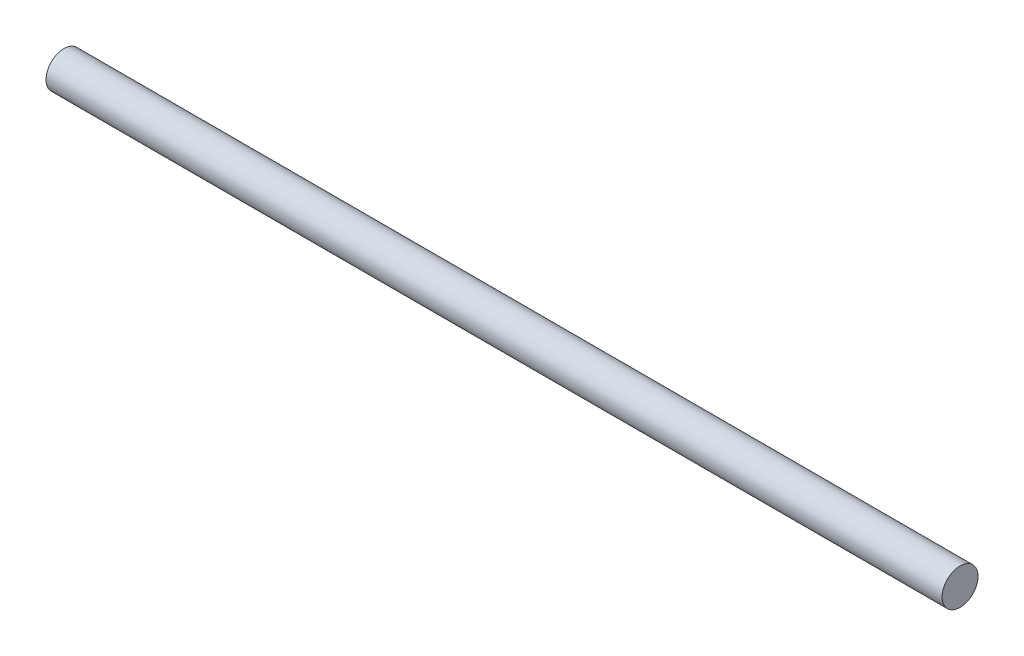
ISO-10303-21;
HEADER;
FILE_DESCRIPTION(('STEP AP214'),'2;1');
FILE_NAME('part.step','',(''),(''),'','','');
FILE_SCHEMA(('AUTOMOTIVE_DESIGN { 1 0 10303 214 1 1 1 1 }'));
ENDSEC;
DATA;
#1=APPLICATION_CONTEXT('core data for automotive mechanical design processes');
#2=APPLICATION_PROTOCOL_DEFINITION('international standard','automotive_design',2000,#1);
#3=PRODUCT_CONTEXT('',#1,'mechanical');
#4=PRODUCT('Part','Part','',(#3));
#5=PRODUCT_RELATED_PRODUCT_CATEGORY('part','',(#4));
#6=PRODUCT_DEFINITION_FORMATION('','',#4);
#7=PRODUCT_DEFINITION_CONTEXT('part definition',#1,'design');
#8=PRODUCT_DEFINITION('design','',#6,#7);
#9=PRODUCT_DEFINITION_SHAPE('','',#8);
#10=(LENGTH_UNIT() NAMED_UNIT(*) SI_UNIT(.MILLI.,.METRE.));
#11=(NAMED_UNIT(*) PLANE_ANGLE_UNIT() SI_UNIT($,.RADIAN.));
#12=(NAMED_UNIT(*) SI_UNIT($,.STERADIAN.) SOLID_ANGLE_UNIT());
#13=UNCERTAINTY_MEASURE_WITH_UNIT(LENGTH_MEASURE(1.E-05),#10,'distance_accuracy_value','');
#14=(GEOMETRIC_REPRESENTATION_CONTEXT(3) GLOBAL_UNCERTAINTY_ASSIGNED_CONTEXT((#13)) GLOBAL_UNIT_ASSIGNED_CONTEXT((#10,
#11,#12)) REPRESENTATION_CONTEXT('',''));
#15=CARTESIAN_POINT('',(0.,0.,0.));
#16=DIRECTION('',(0.,0.,1.));
#17=DIRECTION('',(1.,0.,0.));
#18=AXIS2_PLACEMENT_3D('',#15,#16,#17);
#19=CARTESIAN_POINT('',(949.96,0.,0.));
#20=DIRECTION('',(-1.,0.,0.));
#21=DIRECTION('',(0.,0.,1.));
#22=AXIS2_PLACEMENT_3D('',#19,#20,#21);
#23=CYLINDRICAL_SURFACE('',#22,19.05);
#24=CARTESIAN_POINT('',(949.96,0.,0.));
#25=DIRECTION('',(1.,0.,0.));
#26=DIRECTION('',(0.,0.,-1.));
#27=AXIS2_PLACEMENT_3D('',#24,#25,#26);
#28=CIRCLE('',#27,19.05);
#29=CARTESIAN_POINT('',(949.96,0.,19.05));
#30=VERTEX_POINT('',#29);
#31=EDGE_CURVE('E10',#30,#30,#28,.T.);
#32=CARTESIAN_POINT('',(0.,0.,0.));
#33=DIRECTION('',(1.,0.,0.));
#34=DIRECTION('',(0.,0.,-1.));
#35=AXIS2_PLACEMENT_3D('',#32,#33,#34);
#36=CIRCLE('',#35,19.05);
#37=CARTESIAN_POINT('',(-1.11022302462516E-13,0.,19.05));
#38=VERTEX_POINT('',#37);
#39=EDGE_CURVE('E43',#38,#38,#36,.T.);
#40=CARTESIAN_POINT('',(949.96,0.,19.05));
#41=CARTESIAN_POINT('',(940.064583333333,0.,19.05));
#42=CARTESIAN_POINT('',(930.169166666667,0.,19.05));
#43=CARTESIAN_POINT('',(910.378333333333,0.,19.05));
#44=CARTESIAN_POINT('',(900.482916666667,0.,19.05));
#45=CARTESIAN_POINT('',(880.692083333333,0.,19.05));
#46=CARTESIAN_POINT('',(870.796666666667,0.,19.05));
#47=CARTESIAN_POINT('',(851.005833333333,0.,19.05));
#48=CARTESIAN_POINT('',(841.110416666667,0.,19.05));
#49=CARTESIAN_POINT('',(821.319583333333,0.,19.05));
#50=CARTESIAN_POINT('',(811.424166666666,0.,19.05));
#51=CARTESIAN_POINT('',(791.633333333333,0.,19.05));
#52=CARTESIAN_POINT('',(781.737916666667,0.,19.05));
#53=CARTESIAN_POINT('',(761.947083333333,0.,19.05));
#54=CARTESIAN_POINT('',(752.051666666667,0.,19.05));
#55=CARTESIAN_POINT('',(732.260833333333,0.,19.05));
#56=CARTESIAN_POINT('',(722.365416666667,0.,19.05));
#57=CARTESIAN_POINT('',(702.574583333333,0.,19.05));
#58=CARTESIAN_POINT('',(692.679166666667,0.,19.05));
#59=CARTESIAN_POINT('',(672.888333333333,0.,19.05));
#60=CARTESIAN_POINT('',(662.992916666666,0.,19.05));
#61=CARTESIAN_POINT('',(643.202083333333,0.,19.05));
#62=CARTESIAN_POINT('',(633.306666666667,0.,19.05));
#63=CARTESIAN_POINT('',(613.515833333333,0.,19.05));
#64=CARTESIAN_POINT('',(603.620416666667,0.,19.05));
#65=CARTESIAN_POINT('',(583.829583333333,0.,19.05));
#66=CARTESIAN_POINT('',(573.934166666667,0.,19.05));
#67=CARTESIAN_POINT('',(554.143333333333,0.,19.05));
#68=CARTESIAN_POINT('',(544.247916666666,0.,19.05));
#69=CARTESIAN_POINT('',(524.457083333333,0.,19.05));
#70=CARTESIAN_POINT('',(514.561666666666,0.,19.05));
#71=CARTESIAN_POINT('',(494.770833333333,0.,19.05));
#72=CARTESIAN_POINT('',(484.875416666667,0.,19.05));
#73=CARTESIAN_POINT('',(465.084583333333,0.,19.05));
#74=CARTESIAN_POINT('',(455.189166666667,0.,19.05));
#75=CARTESIAN_POINT('',(435.398333333333,0.,19.05));
#76=CARTESIAN_POINT('',(425.502916666667,0.,19.05));
#77=CARTESIAN_POINT('',(405.712083333333,0.,19.05));
#78=CARTESIAN_POINT('',(395.816666666667,0.,19.05));
#79=CARTESIAN_POINT('',(376.025833333333,0.,19.05));
#80=CARTESIAN_POINT('',(366.130416666667,0.,19.05));
#81=CARTESIAN_POINT('',(346.339583333333,0.,19.05));
#82=CARTESIAN_POINT('',(336.444166666667,0.,19.05));
#83=CARTESIAN_POINT('',(316.653333333333,0.,19.05));
#84=CARTESIAN_POINT('',(306.757916666667,0.,19.05));
#85=CARTESIAN_POINT('',(286.967083333333,0.,19.05));
#86=CARTESIAN_POINT('',(277.071666666667,0.,19.05));
#87=CARTESIAN_POINT('',(257.280833333333,0.,19.05));
#88=CARTESIAN_POINT('',(247.385416666667,0.,19.05));
#89=CARTESIAN_POINT('',(227.594583333333,0.,19.05));
#90=CARTESIAN_POINT('',(217.699166666667,0.,19.05));
#91=CARTESIAN_POINT('',(197.908333333333,0.,19.05));
#92=CARTESIAN_POINT('',(188.012916666667,0.,19.05));
#93=CARTESIAN_POINT('',(168.222083333333,0.,19.05));
#94=CARTESIAN_POINT('',(158.326666666667,0.,19.05));
#95=CARTESIAN_POINT('',(138.535833333333,0.,19.05));
#96=CARTESIAN_POINT('',(128.640416666667,0.,19.05));
#97=CARTESIAN_POINT('',(108.849583333333,0.,19.05));
#98=CARTESIAN_POINT('',(98.9541666666665,0.,19.05));
#99=CARTESIAN_POINT('',(79.1633333333332,0.,19.05));
#100=CARTESIAN_POINT('',(69.2679166666666,0.,19.05));
#101=CARTESIAN_POINT('',(49.4770833333333,0.,19.05));
#102=CARTESIAN_POINT('',(39.5816666666666,0.,19.05));
#103=CARTESIAN_POINT('',(19.7908333333332,0.,19.05));
#104=CARTESIAN_POINT('',(9.89541666666657,0.,19.05));
#105=CARTESIAN_POINT('',(-1.11022302462516E-13,0.,19.05));
#106=B_SPLINE_CURVE_WITH_KNOTS('',3,(#40,#41,#42,#43,#44,#45,#46,#47,#48,#49,#50,#51,#52,#53,
#54,#55,#56,#57,#58,#59,#60,#61,#62,#63,#64,#65,#66,#67,#68,#69,#70,#71,#72,#73,#74,#75,#76,#77,
#78,#79,#80,#81,#82,#83,#84,#85,#86,#87,#88,#89,#90,#91,#92,#93,#94,#95,#96,#97,#98,#99,#100,
#101,#102,#103,#104,#105),.UNSPECIFIED.,.F.,.F.,(4,2,2,2,2,2,2,2,2,2,2,2,2,2,2,2,2,2,2,2,2,2,2,
2,2,2,2,2,2,2,2,2,4),(0.,29.68625,59.3725000000001,89.0587500000001,118.745,148.43125,178.1175,
207.80375,237.49,267.17625,296.8625,326.54875,356.235,385.92125,415.6075,445.29375,474.98,
504.66625,534.3525,564.03875,593.725,623.41125,653.0975,682.78375,712.47,742.15625,771.8425,
801.52875,831.215,860.90125,890.5875,920.27375,949.96),.UNSPECIFIED.);
#107=EDGE_CURVE('BSEAM40',#30,#38,#106,.T.);
#108=ORIENTED_EDGE('',*,*,#31,.F.);
#109=ORIENTED_EDGE('',*,*,#39,.T.);
#110=ORIENTED_EDGE('',*,*,#107,.T.);
#111=ORIENTED_EDGE('',*,*,#107,.F.);
#112=EDGE_LOOP('',(#108,#110,#109,#111));
#113=FACE_BOUND('',#112,.T.);
#114=ADVANCED_FACE('F40',(#113),#23,.T.);
#115=CARTESIAN_POINT('',(949.96,0.,0.));
#116=DIRECTION('',(1.,0.,0.));
#117=DIRECTION('',(0.,0.,-1.));
#118=AXIS2_PLACEMENT_3D('',#115,#116,#117);
#119=PLANE('',#118);
#120=ORIENTED_EDGE('',*,*,#31,.T.);
#121=EDGE_LOOP('',(#120));
#122=FACE_BOUND('',#121,.T.);
#123=ADVANCED_FACE('F57',(#122),#119,.T.);
#124=CARTESIAN_POINT('',(0.,0.,0.));
#125=DIRECTION('',(1.,0.,0.));
#126=DIRECTION('',(0.,0.,-1.));
#127=AXIS2_PLACEMENT_3D('',#124,#125,#126);
#128=PLANE('',#127);
#129=ORIENTED_EDGE('',*,*,#39,.F.);
#130=EDGE_LOOP('',(#129));
#131=FACE_BOUND('',#130,.T.);
#132=ADVANCED_FACE('F55',(#131),#128,.F.);
#133=CLOSED_SHELL('',(#114,#123,#132));
#134=MANIFOLD_SOLID_BREP('B2',#133);
#135=ADVANCED_BREP_SHAPE_REPRESENTATION('',(#18,#134),#14);
#136=SHAPE_DEFINITION_REPRESENTATION(#9,#135);
ENDSEC;
END-ISO-10303-21;
